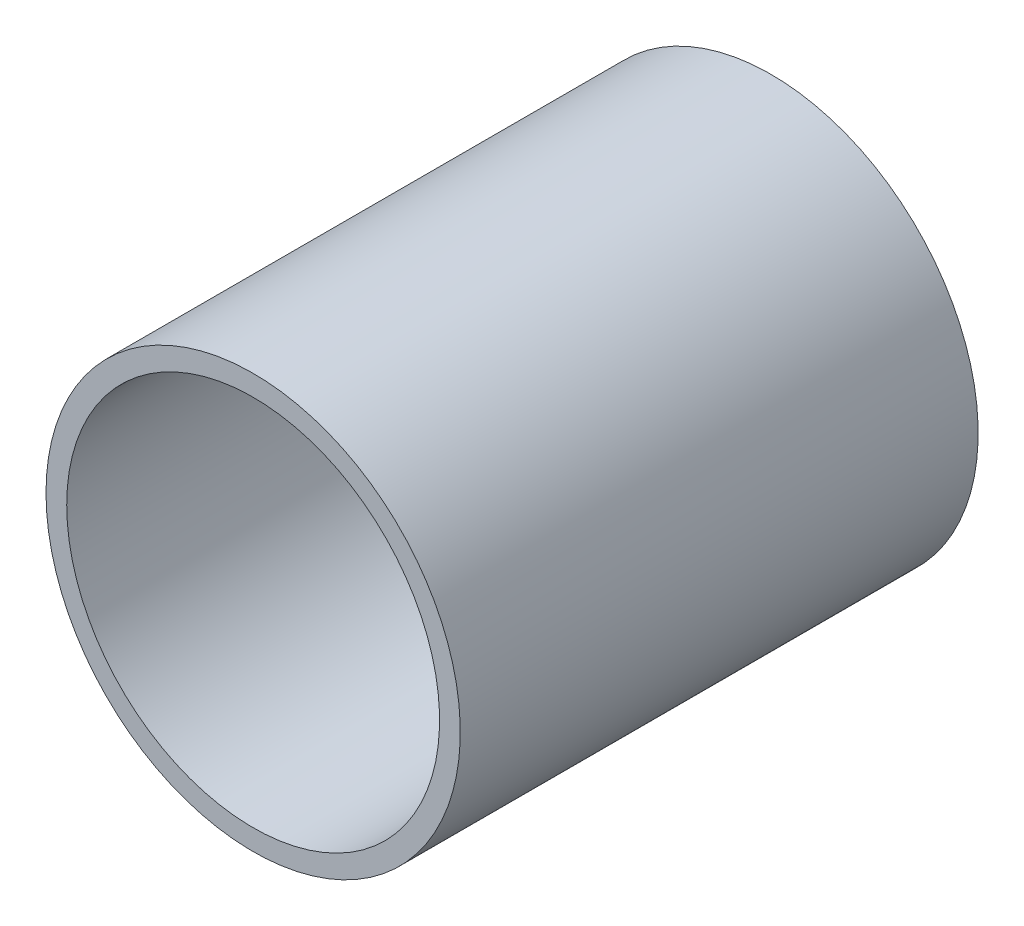
ISO-10303-21;
HEADER;
FILE_DESCRIPTION(('STEP AP214'),'2;1');
FILE_NAME('part.step','',(''),(''),'','','');
FILE_SCHEMA(('AUTOMOTIVE_DESIGN { 1 0 10303 214 1 1 1 1 }'));
ENDSEC;
DATA;
#1=APPLICATION_CONTEXT('core data for automotive mechanical design processes');
#2=APPLICATION_PROTOCOL_DEFINITION('international standard','automotive_design',2000,#1);
#3=PRODUCT_CONTEXT('',#1,'mechanical');
#4=PRODUCT('Part','Part','',(#3));
#5=PRODUCT_RELATED_PRODUCT_CATEGORY('part','',(#4));
#6=PRODUCT_DEFINITION_FORMATION('','',#4);
#7=PRODUCT_DEFINITION_CONTEXT('part definition',#1,'design');
#8=PRODUCT_DEFINITION('design','',#6,#7);
#9=PRODUCT_DEFINITION_SHAPE('','',#8);
#10=(LENGTH_UNIT() NAMED_UNIT(*) SI_UNIT(.MILLI.,.METRE.));
#11=(NAMED_UNIT(*) PLANE_ANGLE_UNIT() SI_UNIT($,.RADIAN.));
#12=(NAMED_UNIT(*) SI_UNIT($,.STERADIAN.) SOLID_ANGLE_UNIT());
#13=UNCERTAINTY_MEASURE_WITH_UNIT(LENGTH_MEASURE(1.E-05),#10,'distance_accuracy_value','');
#14=(GEOMETRIC_REPRESENTATION_CONTEXT(3) GLOBAL_UNCERTAINTY_ASSIGNED_CONTEXT((#13)) GLOBAL_UNIT_ASSIGNED_CONTEXT((#10,
#11,#12)) REPRESENTATION_CONTEXT('',''));
#15=CARTESIAN_POINT('',(0.,0.,0.));
#16=DIRECTION('',(0.,0.,1.));
#17=DIRECTION('',(1.,0.,0.));
#18=AXIS2_PLACEMENT_3D('',#15,#16,#17);
#19=CARTESIAN_POINT('',(0.,166.468017337003,-33.1718975832872));
#20=DIRECTION('',(0.,0.,-1.));
#21=DIRECTION('',(-1.,0.,0.));
#22=AXIS2_PLACEMENT_3D('',#19,#20,#21);
#23=CYLINDRICAL_SURFACE('',#22,9.00000000000001);
#24=CARTESIAN_POINT('',(0.,166.468017337003,-33.1718975832872));
#25=DIRECTION('',(0.,0.,-1.));
#26=DIRECTION('',(-1.,0.,0.));
#27=AXIS2_PLACEMENT_3D('',#24,#25,#26);
#28=CIRCLE('',#27,9.00000000000001);
#29=CARTESIAN_POINT('',(-9.00000000000001,166.468017337003,-33.1718975832872));
#30=VERTEX_POINT('',#29);
#31=EDGE_CURVE('E18',#30,#30,#28,.T.);
#32=ORIENTED_EDGE('',*,*,#31,.F.);
#33=EDGE_LOOP('',(#32));
#34=FACE_BOUND('',#33,.T.);
#35=CARTESIAN_POINT('',(0.,166.468017337003,-58.1718975832872));
#36=DIRECTION('',(0.,0.,-1.));
#37=DIRECTION('',(-1.,0.,0.));
#38=AXIS2_PLACEMENT_3D('',#35,#36,#37);
#39=CIRCLE('',#38,9.00000000000001);
#40=CARTESIAN_POINT('',(-9.00000000000001,166.468017337003,-58.1718975832872));
#41=VERTEX_POINT('',#40);
#42=EDGE_CURVE('E27',#41,#41,#39,.T.);
#43=ORIENTED_EDGE('',*,*,#42,.T.);
#44=EDGE_LOOP('',(#43));
#45=FACE_BOUND('',#44,.T.);
#46=ADVANCED_FACE('F15',(#34,#45),#23,.F.);
#47=CARTESIAN_POINT('',(0.,166.468017337003,-33.1718975832872));
#48=DIRECTION('',(0.,0.,1.));
#49=DIRECTION('',(0.,-1.,0.));
#50=AXIS2_PLACEMENT_3D('',#47,#48,#49);
#51=PLANE('',#50);
#52=ORIENTED_EDGE('',*,*,#31,.T.);
#53=EDGE_LOOP('',(#52));
#54=FACE_BOUND('',#53,.T.);
#55=CARTESIAN_POINT('',(0.,166.468017337003,-33.1718975832872));
#56=DIRECTION('',(0.,0.,-1.));
#57=DIRECTION('',(-1.,0.,0.));
#58=AXIS2_PLACEMENT_3D('',#55,#56,#57);
#59=CIRCLE('',#58,10.);
#60=CARTESIAN_POINT('',(-10.,166.468017337003,-33.1718975832872));
#61=VERTEX_POINT('',#60);
#62=EDGE_CURVE('E22',#61,#61,#59,.T.);
#63=ORIENTED_EDGE('',*,*,#62,.F.);
#64=EDGE_LOOP('',(#63));
#65=FACE_BOUND('',#64,.T.);
#66=ADVANCED_FACE('F35',(#54,#65),#51,.T.);
#67=CARTESIAN_POINT('',(0.,166.468017337003,-58.1718975832872));
#68=DIRECTION('',(0.,0.,1.));
#69=DIRECTION('',(0.,-1.,0.));
#70=AXIS2_PLACEMENT_3D('',#67,#68,#69);
#71=PLANE('',#70);
#72=ORIENTED_EDGE('',*,*,#42,.F.);
#73=EDGE_LOOP('',(#72));
#74=FACE_BOUND('',#73,.T.);
#75=CARTESIAN_POINT('',(0.,166.468017337003,-58.1718975832872));
#76=DIRECTION('',(0.,0.,-1.));
#77=DIRECTION('',(-1.,0.,0.));
#78=AXIS2_PLACEMENT_3D('',#75,#76,#77);
#79=CIRCLE('',#78,10.);
#80=CARTESIAN_POINT('',(-10.,166.468017337003,-58.1718975832872));
#81=VERTEX_POINT('',#80);
#82=EDGE_CURVE('E10',#81,#81,#79,.F.);
#83=ORIENTED_EDGE('',*,*,#82,.F.);
#84=EDGE_LOOP('',(#83));
#85=FACE_BOUND('',#84,.T.);
#86=ADVANCED_FACE('F43',(#74,#85),#71,.F.);
#87=CARTESIAN_POINT('',(0.,166.468017337003,-33.1718975832872));
#88=DIRECTION('',(0.,0.,-1.));
#89=DIRECTION('',(-1.,0.,0.));
#90=AXIS2_PLACEMENT_3D('',#87,#88,#89);
#91=CYLINDRICAL_SURFACE('',#90,10.);
#92=ORIENTED_EDGE('',*,*,#62,.T.);
#93=EDGE_LOOP('',(#92));
#94=FACE_BOUND('',#93,.T.);
#95=ORIENTED_EDGE('',*,*,#82,.T.);
#96=EDGE_LOOP('',(#95));
#97=FACE_BOUND('',#96,.T.);
#98=ADVANCED_FACE('F44',(#94,#97),#91,.T.);
#99=CLOSED_SHELL('',(#46,#66,#86,#98));
#100=MANIFOLD_SOLID_BREP('B1',#99);
#101=ADVANCED_BREP_SHAPE_REPRESENTATION('',(#18,#100),#14);
#102=SHAPE_DEFINITION_REPRESENTATION(#9,#101);
ENDSEC;
END-ISO-10303-21;
